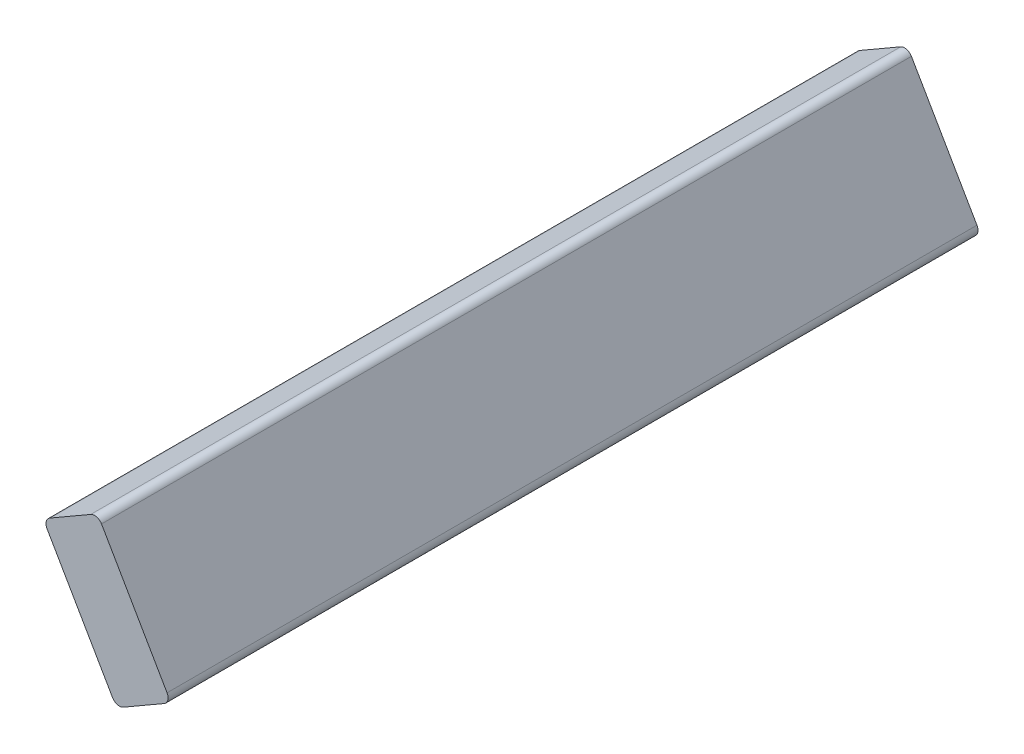
ISO-10303-21;
HEADER;
FILE_DESCRIPTION(('STEP AP214'),'2;1');
FILE_NAME('part.step','',(''),(''),'','','');
FILE_SCHEMA(('AUTOMOTIVE_DESIGN { 1 0 10303 214 1 1 1 1 }'));
ENDSEC;
DATA;
#1=APPLICATION_CONTEXT('core data for automotive mechanical design processes');
#2=APPLICATION_PROTOCOL_DEFINITION('international standard','automotive_design',2000,#1);
#3=PRODUCT_CONTEXT('',#1,'mechanical');
#4=PRODUCT('Part','Part','',(#3));
#5=PRODUCT_RELATED_PRODUCT_CATEGORY('part','',(#4));
#6=PRODUCT_DEFINITION_FORMATION('','',#4);
#7=PRODUCT_DEFINITION_CONTEXT('part definition',#1,'design');
#8=PRODUCT_DEFINITION('design','',#6,#7);
#9=PRODUCT_DEFINITION_SHAPE('','',#8);
#10=(LENGTH_UNIT() NAMED_UNIT(*) SI_UNIT(.MILLI.,.METRE.));
#11=(NAMED_UNIT(*) PLANE_ANGLE_UNIT() SI_UNIT($,.RADIAN.));
#12=(NAMED_UNIT(*) SI_UNIT($,.STERADIAN.) SOLID_ANGLE_UNIT());
#13=UNCERTAINTY_MEASURE_WITH_UNIT(LENGTH_MEASURE(1.E-05),#10,'distance_accuracy_value','');
#14=(GEOMETRIC_REPRESENTATION_CONTEXT(3) GLOBAL_UNCERTAINTY_ASSIGNED_CONTEXT((#13)) GLOBAL_UNIT_ASSIGNED_CONTEXT((#10,
#11,#12)) REPRESENTATION_CONTEXT('',''));
#15=CARTESIAN_POINT('',(0.,0.,0.));
#16=DIRECTION('',(0.,0.,1.));
#17=DIRECTION('',(1.,0.,0.));
#18=AXIS2_PLACEMENT_3D('',#15,#16,#17);
#19=CARTESIAN_POINT('',(0.,0.,0.));
#20=DIRECTION('',(0.,0.,1.));
#21=DIRECTION('',(1.,0.,0.));
#22=AXIS2_PLACEMENT_3D('',#19,#20,#21);
#23=PLANE('',#22);
#24=DIRECTION('',(0.866025403784439,0.5,0.));
#25=VECTOR('',#24,1.);
#26=CARTESIAN_POINT('',(227.693380196504,-470.576503047442,0.));
#27=LINE('',#26,#25);
#28=CARTESIAN_POINT('',(231.817826182027,-468.195253047442,0.));
#29=VERTEX_POINT('',#28);
#30=CARTESIAN_POINT('',(256.564502095168,-453.907753047442,0.));
#31=VERTEX_POINT('',#30);
#32=EDGE_CURVE('E111',#29,#31,#27,.T.);
#33=ORIENTED_EDGE('',*,*,#32,.F.);
#34=CARTESIAN_POINT('',(229.436576182027,-464.070807061918,0.));
#35=DIRECTION('',(0.,0.,1.));
#36=DIRECTION('',(1.,0.,0.));
#37=AXIS2_PLACEMENT_3D('',#34,#35,#36);
#38=CIRCLE('',#37,4.7625);
#39=CARTESIAN_POINT('',(225.312130196504,-466.452057061918,0.));
#40=VERTEX_POINT('',#39);
#41=EDGE_CURVE('E166',#29,#40,#38,.F.);
#42=ORIENTED_EDGE('',*,*,#41,.T.);
#43=DIRECTION('',(0.5,-0.866025403784439,0.));
#44=VECTOR('',#43,1.);
#45=CARTESIAN_POINT('',(227.693380196504,-470.576503047442,0.));
#46=LINE('',#45,#44);
#47=CARTESIAN_POINT('',(185.624630196504,-397.711290636529,0.));
#48=VERTEX_POINT('',#47);
#49=EDGE_CURVE('E151',#48,#40,#46,.T.);
#50=ORIENTED_EDGE('',*,*,#49,.F.);
#51=CARTESIAN_POINT('',(189.749076182027,-395.330040636529,0.));
#52=DIRECTION('',(0.,0.,1.));
#53=DIRECTION('',(1.,0.,0.));
#54=AXIS2_PLACEMENT_3D('',#51,#52,#53);
#55=CIRCLE('',#54,4.7625);
#56=CARTESIAN_POINT('',(187.367826182027,-391.205594651005,0.));
#57=VERTEX_POINT('',#56);
#58=EDGE_CURVE('E164',#48,#57,#55,.F.);
#59=ORIENTED_EDGE('',*,*,#58,.T.);
#60=DIRECTION('',(-0.866025403784438,-0.5,0.));
#61=VECTOR('',#60,1.);
#62=CARTESIAN_POINT('',(183.243380196504,-393.586844651005,0.));
#63=LINE('',#62,#61);
#64=CARTESIAN_POINT('',(212.114502095168,-376.918094651005,0.));
#65=VERTEX_POINT('',#64);
#66=EDGE_CURVE('E149',#65,#57,#63,.T.);
#67=ORIENTED_EDGE('',*,*,#66,.F.);
#68=CARTESIAN_POINT('',(214.495752095167,-381.042540636529,0.));
#69=DIRECTION('',(0.,0.,1.));
#70=DIRECTION('',(1.,0.,0.));
#71=AXIS2_PLACEMENT_3D('',#68,#69,#70);
#72=CIRCLE('',#71,4.7625);
#73=CARTESIAN_POINT('',(218.620198080691,-378.661290636529,0.));
#74=VERTEX_POINT('',#73);
#75=EDGE_CURVE('E148',#65,#74,#72,.F.);
#76=ORIENTED_EDGE('',*,*,#75,.T.);
#77=DIRECTION('',(-0.5,0.866025403784439,0.));
#78=VECTOR('',#77,1.);
#79=CARTESIAN_POINT('',(260.688948080691,-451.526503047442,0.));
#80=LINE('',#79,#78);
#81=CARTESIAN_POINT('',(258.307698080691,-447.402057061918,0.));
#82=VERTEX_POINT('',#81);
#83=EDGE_CURVE('E143',#82,#74,#80,.T.);
#84=ORIENTED_EDGE('',*,*,#83,.F.);
#85=CARTESIAN_POINT('',(254.183252095168,-449.783307061918,0.));
#86=DIRECTION('',(0.,0.,1.));
#87=DIRECTION('',(1.,0.,0.));
#88=AXIS2_PLACEMENT_3D('',#85,#86,#87);
#89=CIRCLE('',#88,4.7625);
#90=EDGE_CURVE('E146',#82,#31,#89,.F.);
#91=ORIENTED_EDGE('',*,*,#90,.T.);
#92=EDGE_LOOP('',(#33,#42,#50,#59,#67,#76,#84,#91));
#93=FACE_BOUND('',#92,.T.);
#94=ADVANCED_FACE('F37',(#93),#23,.F.);
#95=CARTESIAN_POINT('',(227.693380196504,-470.576503047442,613.913128567367));
#96=DIRECTION('',(0.866025403784439,0.5,0.));
#97=DIRECTION('',(-0.5,0.866025403784439,0.));
#98=AXIS2_PLACEMENT_3D('',#95,#96,#97);
#99=PLANE('',#98);
#100=ORIENTED_EDGE('',*,*,#49,.T.);
#101=DIRECTION('',(0.,0.,-1.));
#102=VECTOR('',#101,1.);
#103=CARTESIAN_POINT('',(225.312130196504,-466.452057061918,613.913128567367));
#104=LINE('',#103,#102);
#105=CARTESIAN_POINT('',(225.312130196504,-466.452057061918,490.53796101));
#106=VERTEX_POINT('',#105);
#107=EDGE_CURVE('E126',#40,#106,#104,.F.);
#108=ORIENTED_EDGE('',*,*,#107,.T.);
#109=DIRECTION('',(-0.5,0.866025403784439,0.));
#110=VECTOR('',#109,1.);
#111=CARTESIAN_POINT('',(227.693380196504,-470.576503047442,490.53796101));
#112=LINE('',#111,#110);
#113=CARTESIAN_POINT('',(185.624630196504,-397.711290636529,490.53796101));
#114=VERTEX_POINT('',#113);
#115=EDGE_CURVE('E157',#106,#114,#112,.T.);
#116=ORIENTED_EDGE('',*,*,#115,.T.);
#117=DIRECTION('',(0.,0.,-1.));
#118=VECTOR('',#117,1.);
#119=CARTESIAN_POINT('',(185.624630196504,-397.711290636529,613.913128567367));
#120=LINE('',#119,#118);
#121=EDGE_CURVE('E130',#114,#48,#120,.T.);
#122=ORIENTED_EDGE('',*,*,#121,.T.);
#123=EDGE_LOOP('',(#100,#108,#116,#122));
#124=FACE_BOUND('',#123,.T.);
#125=ADVANCED_FACE('F171',(#124),#99,.F.);
#126=CARTESIAN_POINT('',(183.243380196504,-393.586844651005,613.913128567367));
#127=DIRECTION('',(0.5,-0.866025403784438,0.));
#128=DIRECTION('',(0.866025403784439,0.5,0.));
#129=AXIS2_PLACEMENT_3D('',#126,#127,#128);
#130=PLANE('',#129);
#131=ORIENTED_EDGE('',*,*,#66,.T.);
#132=DIRECTION('',(0.,0.,-1.));
#133=VECTOR('',#132,1.);
#134=CARTESIAN_POINT('',(187.367826182027,-391.205594651005,613.913128567367));
#135=LINE('',#134,#133);
#136=CARTESIAN_POINT('',(187.367826182027,-391.205594651005,490.53796101));
#137=VERTEX_POINT('',#136);
#138=EDGE_CURVE('E59',#57,#137,#135,.F.);
#139=ORIENTED_EDGE('',*,*,#138,.T.);
#140=DIRECTION('',(0.866025403784439,0.5,0.));
#141=VECTOR('',#140,1.);
#142=CARTESIAN_POINT('',(183.243380196504,-393.586844651005,490.53796101));
#143=LINE('',#142,#141);
#144=CARTESIAN_POINT('',(212.114502095168,-376.918094651005,490.53796101));
#145=VERTEX_POINT('',#144);
#146=EDGE_CURVE('E159',#137,#145,#143,.T.);
#147=ORIENTED_EDGE('',*,*,#146,.T.);
#148=DIRECTION('',(0.,0.,-1.));
#149=VECTOR('',#148,1.);
#150=CARTESIAN_POINT('',(212.114502095168,-376.918094651005,613.913128567367));
#151=LINE('',#150,#149);
#152=EDGE_CURVE('E136',#145,#65,#151,.T.);
#153=ORIENTED_EDGE('',*,*,#152,.T.);
#154=EDGE_LOOP('',(#131,#139,#147,#153));
#155=FACE_BOUND('',#154,.T.);
#156=ADVANCED_FACE('F192',(#155),#130,.F.);
#157=CARTESIAN_POINT('',(260.688948080691,-451.526503047442,613.913128567367));
#158=DIRECTION('',(-0.866025403784439,-0.5,0.));
#159=DIRECTION('',(0.5,-0.866025403784439,0.));
#160=AXIS2_PLACEMENT_3D('',#157,#158,#159);
#161=PLANE('',#160);
#162=ORIENTED_EDGE('',*,*,#83,.T.);
#163=DIRECTION('',(0.,0.,-1.));
#164=VECTOR('',#163,1.);
#165=CARTESIAN_POINT('',(218.620198080691,-378.661290636529,613.913128567367));
#166=LINE('',#165,#164);
#167=CARTESIAN_POINT('',(218.620198080691,-378.661290636529,490.53796101));
#168=VERTEX_POINT('',#167);
#169=EDGE_CURVE('E11',#74,#168,#166,.F.);
#170=ORIENTED_EDGE('',*,*,#169,.T.);
#171=DIRECTION('',(0.5,-0.866025403784439,0.));
#172=VECTOR('',#171,1.);
#173=CARTESIAN_POINT('',(260.688948080691,-451.526503047442,490.53796101));
#174=LINE('',#173,#172);
#175=CARTESIAN_POINT('',(258.307698080691,-447.402057061918,490.53796101));
#176=VERTEX_POINT('',#175);
#177=EDGE_CURVE('E122',#168,#176,#174,.T.);
#178=ORIENTED_EDGE('',*,*,#177,.T.);
#179=DIRECTION('',(0.,0.,-1.));
#180=VECTOR('',#179,1.);
#181=CARTESIAN_POINT('',(258.307698080691,-447.402057061918,613.913128567367));
#182=LINE('',#181,#180);
#183=EDGE_CURVE('E45',#176,#82,#182,.T.);
#184=ORIENTED_EDGE('',*,*,#183,.T.);
#185=EDGE_LOOP('',(#162,#170,#178,#184));
#186=FACE_BOUND('',#185,.T.);
#187=ADVANCED_FACE('F142',(#186),#161,.F.);
#188=CARTESIAN_POINT('',(227.693380196504,-470.576503047442,613.913128567367));
#189=DIRECTION('',(-0.5,0.866025403784439,0.));
#190=DIRECTION('',(-0.866025403784439,-0.5,0.));
#191=AXIS2_PLACEMENT_3D('',#188,#189,#190);
#192=PLANE('',#191);
#193=DIRECTION('',(-0.866025403784439,-0.5,0.));
#194=VECTOR('',#193,1.);
#195=CARTESIAN_POINT('',(227.693380196504,-470.576503047442,490.53796101));
#196=LINE('',#195,#194);
#197=CARTESIAN_POINT('',(256.564502095168,-453.907753047442,490.53796101));
#198=VERTEX_POINT('',#197);
#199=CARTESIAN_POINT('',(231.817826182027,-468.195253047442,490.53796101));
#200=VERTEX_POINT('',#199);
#201=EDGE_CURVE('E108',#198,#200,#196,.T.);
#202=ORIENTED_EDGE('',*,*,#201,.T.);
#203=DIRECTION('',(0.,0.,-1.));
#204=VECTOR('',#203,1.);
#205=CARTESIAN_POINT('',(231.817826182027,-468.195253047442,613.913128567367));
#206=LINE('',#205,#204);
#207=EDGE_CURVE('E114',#200,#29,#206,.T.);
#208=ORIENTED_EDGE('',*,*,#207,.T.);
#209=ORIENTED_EDGE('',*,*,#32,.T.);
#210=DIRECTION('',(0.,0.,-1.));
#211=VECTOR('',#210,1.);
#212=CARTESIAN_POINT('',(256.564502095168,-453.907753047442,613.913128567367));
#213=LINE('',#212,#211);
#214=EDGE_CURVE('E104',#31,#198,#213,.F.);
#215=ORIENTED_EDGE('',*,*,#214,.T.);
#216=EDGE_LOOP('',(#202,#208,#209,#215));
#217=FACE_BOUND('',#216,.T.);
#218=ADVANCED_FACE('F106',(#217),#192,.F.);
#219=CARTESIAN_POINT('',(0.,0.,490.53796101));
#220=DIRECTION('',(0.,0.,-1.));
#221=DIRECTION('',(0.,1.,0.));
#222=AXIS2_PLACEMENT_3D('',#219,#220,#221);
#223=PLANE('',#222);
#224=ORIENTED_EDGE('',*,*,#115,.F.);
#225=CARTESIAN_POINT('',(229.436576182027,-464.070807061918,490.53796101));
#226=DIRECTION('',(0.,0.,-1.));
#227=DIRECTION('',(-1.,0.,0.));
#228=AXIS2_PLACEMENT_3D('',#225,#226,#227);
#229=CIRCLE('',#228,4.7625);
#230=EDGE_CURVE('E121',#106,#200,#229,.F.);
#231=ORIENTED_EDGE('',*,*,#230,.T.);
#232=ORIENTED_EDGE('',*,*,#201,.F.);
#233=CARTESIAN_POINT('',(254.183252095168,-449.783307061918,490.53796101));
#234=DIRECTION('',(0.,0.,-1.));
#235=DIRECTION('',(-1.,0.,0.));
#236=AXIS2_PLACEMENT_3D('',#233,#234,#235);
#237=CIRCLE('',#236,4.7625);
#238=EDGE_CURVE('E118',#198,#176,#237,.F.);
#239=ORIENTED_EDGE('',*,*,#238,.T.);
#240=ORIENTED_EDGE('',*,*,#177,.F.);
#241=CARTESIAN_POINT('',(214.495752095167,-381.042540636529,490.53796101));
#242=DIRECTION('',(0.,0.,-1.));
#243=DIRECTION('',(-1.,0.,0.));
#244=AXIS2_PLACEMENT_3D('',#241,#242,#243);
#245=CIRCLE('',#244,4.7625);
#246=EDGE_CURVE('E52',#168,#145,#245,.F.);
#247=ORIENTED_EDGE('',*,*,#246,.T.);
#248=ORIENTED_EDGE('',*,*,#146,.F.);
#249=CARTESIAN_POINT('',(189.749076182027,-395.330040636529,490.53796101));
#250=DIRECTION('',(0.,0.,-1.));
#251=DIRECTION('',(-1.,0.,0.));
#252=AXIS2_PLACEMENT_3D('',#249,#250,#251);
#253=CIRCLE('',#252,4.7625);
#254=EDGE_CURVE('E128',#137,#114,#253,.F.);
#255=ORIENTED_EDGE('',*,*,#254,.T.);
#256=EDGE_LOOP('',(#224,#231,#232,#239,#240,#247,#248,#255));
#257=FACE_BOUND('',#256,.T.);
#258=ADVANCED_FACE('F117',(#257),#223,.F.);
#259=CARTESIAN_POINT('',(229.436576182027,-464.070807061918,613.913128567367));
#260=DIRECTION('',(0.,0.,-1.));
#261=DIRECTION('',(-1.,0.,0.));
#262=AXIS2_PLACEMENT_3D('',#259,#260,#261);
#263=CYLINDRICAL_SURFACE('',#262,4.7625);
#264=ORIENTED_EDGE('',*,*,#230,.F.);
#265=ORIENTED_EDGE('',*,*,#107,.F.);
#266=ORIENTED_EDGE('',*,*,#41,.F.);
#267=ORIENTED_EDGE('',*,*,#207,.F.);
#268=EDGE_LOOP('',(#264,#265,#266,#267));
#269=FACE_BOUND('',#268,.T.);
#270=ADVANCED_FACE('F176',(#269),#263,.T.);
#271=CARTESIAN_POINT('',(189.749076182027,-395.330040636529,613.913128567367));
#272=DIRECTION('',(0.,0.,-1.));
#273=DIRECTION('',(-1.,0.,0.));
#274=AXIS2_PLACEMENT_3D('',#271,#272,#273);
#275=CYLINDRICAL_SURFACE('',#274,4.7625);
#276=ORIENTED_EDGE('',*,*,#254,.F.);
#277=ORIENTED_EDGE('',*,*,#138,.F.);
#278=ORIENTED_EDGE('',*,*,#58,.F.);
#279=ORIENTED_EDGE('',*,*,#121,.F.);
#280=EDGE_LOOP('',(#276,#277,#278,#279));
#281=FACE_BOUND('',#280,.T.);
#282=ADVANCED_FACE('F177',(#281),#275,.T.);
#283=CARTESIAN_POINT('',(214.495752095167,-381.042540636529,613.913128567367));
#284=DIRECTION('',(0.,0.,-1.));
#285=DIRECTION('',(-1.,0.,0.));
#286=AXIS2_PLACEMENT_3D('',#283,#284,#285);
#287=CYLINDRICAL_SURFACE('',#286,4.7625);
#288=ORIENTED_EDGE('',*,*,#246,.F.);
#289=ORIENTED_EDGE('',*,*,#169,.F.);
#290=ORIENTED_EDGE('',*,*,#75,.F.);
#291=ORIENTED_EDGE('',*,*,#152,.F.);
#292=EDGE_LOOP('',(#288,#289,#290,#291));
#293=FACE_BOUND('',#292,.T.);
#294=ADVANCED_FACE('F179',(#293),#287,.T.);
#295=CARTESIAN_POINT('',(254.183252095168,-449.783307061918,613.913128567367));
#296=DIRECTION('',(0.,0.,-1.));
#297=DIRECTION('',(-1.,0.,0.));
#298=AXIS2_PLACEMENT_3D('',#295,#296,#297);
#299=CYLINDRICAL_SURFACE('',#298,4.7625);
#300=ORIENTED_EDGE('',*,*,#238,.F.);
#301=ORIENTED_EDGE('',*,*,#214,.F.);
#302=ORIENTED_EDGE('',*,*,#90,.F.);
#303=ORIENTED_EDGE('',*,*,#183,.F.);
#304=EDGE_LOOP('',(#300,#301,#302,#303));
#305=FACE_BOUND('',#304,.T.);
#306=ADVANCED_FACE('F39',(#305),#299,.T.);
#307=CLOSED_SHELL('',(#94,#125,#156,#187,#218,#258,#270,#282,#294,#306));
#308=MANIFOLD_SOLID_BREP('B2',#307);
#309=ADVANCED_BREP_SHAPE_REPRESENTATION('',(#18,#308),#14);
#310=SHAPE_DEFINITION_REPRESENTATION(#9,#309);
ENDSEC;
END-ISO-10303-21;
